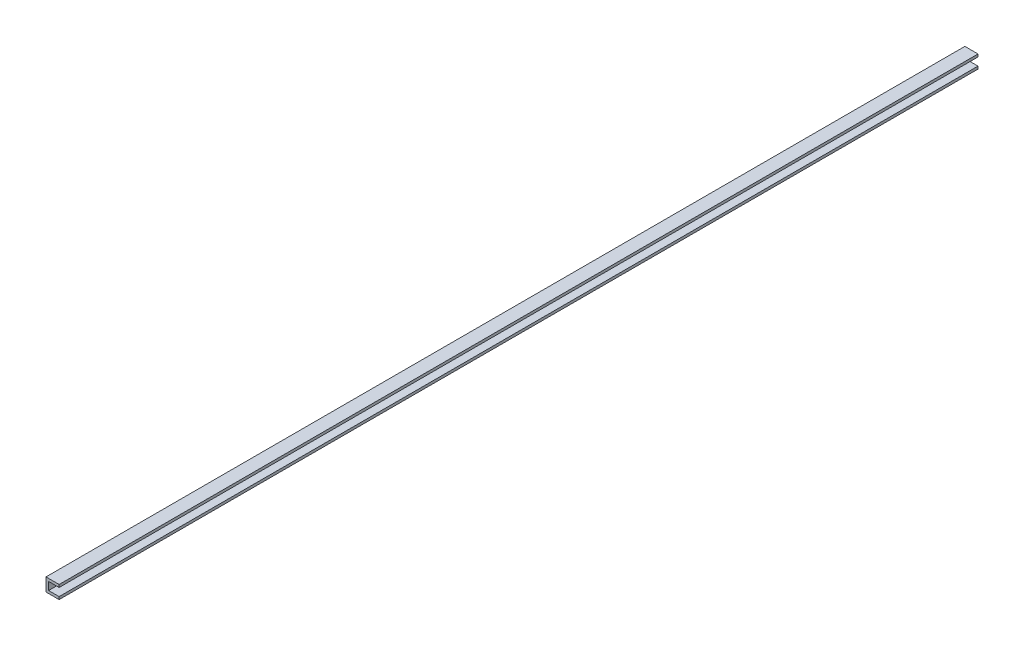
ISO-10303-21;
HEADER;
FILE_DESCRIPTION(('STEP AP214'),'2;1');
FILE_NAME('part.step','',(''),(''),'','','');
FILE_SCHEMA(('AUTOMOTIVE_DESIGN { 1 0 10303 214 1 1 1 1 }'));
ENDSEC;
DATA;
#1=APPLICATION_CONTEXT('core data for automotive mechanical design processes');
#2=APPLICATION_PROTOCOL_DEFINITION('international standard','automotive_design',2000,#1);
#3=PRODUCT_CONTEXT('',#1,'mechanical');
#4=PRODUCT('Part','Part','',(#3));
#5=PRODUCT_RELATED_PRODUCT_CATEGORY('part','',(#4));
#6=PRODUCT_DEFINITION_FORMATION('','',#4);
#7=PRODUCT_DEFINITION_CONTEXT('part definition',#1,'design');
#8=PRODUCT_DEFINITION('design','',#6,#7);
#9=PRODUCT_DEFINITION_SHAPE('','',#8);
#10=(LENGTH_UNIT() NAMED_UNIT(*) SI_UNIT(.MILLI.,.METRE.));
#11=(NAMED_UNIT(*) PLANE_ANGLE_UNIT() SI_UNIT($,.RADIAN.));
#12=(NAMED_UNIT(*) SI_UNIT($,.STERADIAN.) SOLID_ANGLE_UNIT());
#13=UNCERTAINTY_MEASURE_WITH_UNIT(LENGTH_MEASURE(1.E-05),#10,'distance_accuracy_value','');
#14=(GEOMETRIC_REPRESENTATION_CONTEXT(3) GLOBAL_UNCERTAINTY_ASSIGNED_CONTEXT((#13)) GLOBAL_UNIT_ASSIGNED_CONTEXT((#10,
#11,#12)) REPRESENTATION_CONTEXT('',''));
#15=CARTESIAN_POINT('',(0.,0.,0.));
#16=DIRECTION('',(0.,0.,1.));
#17=DIRECTION('',(1.,0.,0.));
#18=AXIS2_PLACEMENT_3D('',#15,#16,#17);
#19=CARTESIAN_POINT('',(2.64710022277,-3.,-350.));
#20=DIRECTION('',(0.,1.,0.));
#21=DIRECTION('',(0.,0.,1.));
#22=AXIS2_PLACEMENT_3D('',#19,#20,#21);
#23=PLANE('',#22);
#24=DIRECTION('',(0.,0.,-1.));
#25=VECTOR('',#24,1.);
#26=CARTESIAN_POINT('',(2.64710022277,-3.,-350.));
#27=LINE('',#26,#25);
#28=CARTESIAN_POINT('',(2.64710022277,-3.,-350.));
#29=VERTEX_POINT('',#28);
#30=CARTESIAN_POINT('',(2.64710022277,-3.,350.));
#31=VERTEX_POINT('',#30);
#32=EDGE_CURVE('E84',#29,#31,#27,.F.);
#33=ORIENTED_EDGE('',*,*,#32,.F.);
#34=DIRECTION('',(1.,0.,0.));
#35=VECTOR('',#34,1.);
#36=CARTESIAN_POINT('',(0.,-3.,-350.));
#37=LINE('',#36,#35);
#38=CARTESIAN_POINT('',(-5.35289977723,-3.,-350.));
#39=VERTEX_POINT('',#38);
#40=EDGE_CURVE('E123',#29,#39,#37,.F.);
#41=ORIENTED_EDGE('',*,*,#40,.T.);
#42=DIRECTION('',(0.,0.,-1.));
#43=VECTOR('',#42,1.);
#44=CARTESIAN_POINT('',(-5.35289977723,-3.,-350.));
#45=LINE('',#44,#43);
#46=CARTESIAN_POINT('',(-5.35289977723,-3.,350.));
#47=VERTEX_POINT('',#46);
#48=EDGE_CURVE('E20',#47,#39,#45,.T.);
#49=ORIENTED_EDGE('',*,*,#48,.F.);
#50=DIRECTION('',(1.,0.,0.));
#51=VECTOR('',#50,1.);
#52=CARTESIAN_POINT('',(0.,-3.,350.));
#53=LINE('',#52,#51);
#54=EDGE_CURVE('E95',#31,#47,#53,.F.);
#55=ORIENTED_EDGE('',*,*,#54,.F.);
#56=EDGE_LOOP('',(#33,#41,#49,#55));
#57=FACE_BOUND('',#56,.T.);
#58=ADVANCED_FACE('F17',(#57),#23,.T.);
#59=CARTESIAN_POINT('',(-5.35289977723,-3.,-350.));
#60=DIRECTION('',(1.,0.,0.));
#61=DIRECTION('',(0.,0.,-1.));
#62=AXIS2_PLACEMENT_3D('',#59,#60,#61);
#63=PLANE('',#62);
#64=ORIENTED_EDGE('',*,*,#48,.T.);
#65=DIRECTION('',(0.,1.,0.));
#66=VECTOR('',#65,1.);
#67=CARTESIAN_POINT('',(-5.35289977723,0.,-350.));
#68=LINE('',#67,#66);
#69=CARTESIAN_POINT('',(-5.35289977723,3.,-350.));
#70=VERTEX_POINT('',#69);
#71=EDGE_CURVE('E119',#39,#70,#68,.T.);
#72=ORIENTED_EDGE('',*,*,#71,.T.);
#73=DIRECTION('',(0.,0.,-1.));
#74=VECTOR('',#73,1.);
#75=CARTESIAN_POINT('',(-5.35289977723,3.,-350.));
#76=LINE('',#75,#74);
#77=CARTESIAN_POINT('',(-5.35289977723,3.,350.));
#78=VERTEX_POINT('',#77);
#79=EDGE_CURVE('E111',#78,#70,#76,.T.);
#80=ORIENTED_EDGE('',*,*,#79,.F.);
#81=DIRECTION('',(0.,1.,0.));
#82=VECTOR('',#81,1.);
#83=CARTESIAN_POINT('',(-5.35289977723,0.,350.));
#84=LINE('',#83,#82);
#85=EDGE_CURVE('E98',#47,#78,#84,.T.);
#86=ORIENTED_EDGE('',*,*,#85,.F.);
#87=EDGE_LOOP('',(#64,#72,#80,#86));
#88=FACE_BOUND('',#87,.T.);
#89=ADVANCED_FACE('F118',(#88),#63,.T.);
#90=CARTESIAN_POINT('',(-5.35289977723,3.,-350.));
#91=DIRECTION('',(0.,-1.,0.));
#92=DIRECTION('',(0.,0.,-1.));
#93=AXIS2_PLACEMENT_3D('',#90,#91,#92);
#94=PLANE('',#93);
#95=ORIENTED_EDGE('',*,*,#79,.T.);
#96=DIRECTION('',(1.,0.,0.));
#97=VECTOR('',#96,1.);
#98=CARTESIAN_POINT('',(0.,3.,-350.));
#99=LINE('',#98,#97);
#100=CARTESIAN_POINT('',(2.64710022277,3.,-350.));
#101=VERTEX_POINT('',#100);
#102=EDGE_CURVE('E125',#70,#101,#99,.T.);
#103=ORIENTED_EDGE('',*,*,#102,.T.);
#104=DIRECTION('',(0.,0.,-1.));
#105=VECTOR('',#104,1.);
#106=CARTESIAN_POINT('',(2.64710022277,3.,-350.));
#107=LINE('',#106,#105);
#108=CARTESIAN_POINT('',(2.64710022277,3.,350.));
#109=VERTEX_POINT('',#108);
#110=EDGE_CURVE('E109',#109,#101,#107,.T.);
#111=ORIENTED_EDGE('',*,*,#110,.F.);
#112=DIRECTION('',(1.,0.,0.));
#113=VECTOR('',#112,1.);
#114=CARTESIAN_POINT('',(0.,3.,350.));
#115=LINE('',#114,#113);
#116=EDGE_CURVE('E143',#78,#109,#115,.T.);
#117=ORIENTED_EDGE('',*,*,#116,.F.);
#118=EDGE_LOOP('',(#95,#103,#111,#117));
#119=FACE_BOUND('',#118,.T.);
#120=ADVANCED_FACE('F146',(#119),#94,.T.);
#121=CARTESIAN_POINT('',(2.64710022277,3.,-350.));
#122=DIRECTION('',(1.,0.,0.));
#123=DIRECTION('',(0.,0.,-1.));
#124=AXIS2_PLACEMENT_3D('',#121,#122,#123);
#125=PLANE('',#124);
#126=ORIENTED_EDGE('',*,*,#110,.T.);
#127=DIRECTION('',(0.,1.,0.));
#128=VECTOR('',#127,1.);
#129=CARTESIAN_POINT('',(2.64710022277,0.,-350.));
#130=LINE('',#129,#128);
#131=CARTESIAN_POINT('',(2.64710022277,5.,-350.));
#132=VERTEX_POINT('',#131);
#133=EDGE_CURVE('E127',#101,#132,#130,.T.);
#134=ORIENTED_EDGE('',*,*,#133,.T.);
#135=DIRECTION('',(0.,0.,1.));
#136=VECTOR('',#135,1.);
#137=CARTESIAN_POINT('',(2.64710022277,5.,-350.));
#138=LINE('',#137,#136);
#139=CARTESIAN_POINT('',(2.64710022277,5.,350.));
#140=VERTEX_POINT('',#139);
#141=EDGE_CURVE('E92',#140,#132,#138,.F.);
#142=ORIENTED_EDGE('',*,*,#141,.F.);
#143=DIRECTION('',(0.,1.,0.));
#144=VECTOR('',#143,1.);
#145=CARTESIAN_POINT('',(2.64710022277,0.,350.));
#146=LINE('',#145,#144);
#147=EDGE_CURVE('E140',#109,#140,#146,.T.);
#148=ORIENTED_EDGE('',*,*,#147,.F.);
#149=EDGE_LOOP('',(#126,#134,#142,#148));
#150=FACE_BOUND('',#149,.T.);
#151=ADVANCED_FACE('F148',(#150),#125,.T.);
#152=CARTESIAN_POINT('',(2.64710022277,5.,-350.));
#153=DIRECTION('',(0.,1.,0.));
#154=DIRECTION('',(0.,0.,1.));
#155=AXIS2_PLACEMENT_3D('',#152,#153,#154);
#156=PLANE('',#155);
#157=ORIENTED_EDGE('',*,*,#141,.T.);
#158=DIRECTION('',(1.,0.,0.));
#159=VECTOR('',#158,1.);
#160=CARTESIAN_POINT('',(0.,5.,-350.));
#161=LINE('',#160,#159);
#162=CARTESIAN_POINT('',(-7.35289977723,5.,-350.));
#163=VERTEX_POINT('',#162);
#164=EDGE_CURVE('E163',#132,#163,#161,.F.);
#165=ORIENTED_EDGE('',*,*,#164,.T.);
#166=DIRECTION('',(0.,0.,1.));
#167=VECTOR('',#166,1.);
#168=CARTESIAN_POINT('',(-7.35289977723,5.,-350.));
#169=LINE('',#168,#167);
#170=CARTESIAN_POINT('',(-7.35289977723,5.,350.));
#171=VERTEX_POINT('',#170);
#172=EDGE_CURVE('E133',#171,#163,#169,.F.);
#173=ORIENTED_EDGE('',*,*,#172,.F.);
#174=DIRECTION('',(1.,0.,0.));
#175=VECTOR('',#174,1.);
#176=CARTESIAN_POINT('',(0.,5.,350.));
#177=LINE('',#176,#175);
#178=EDGE_CURVE('E138',#140,#171,#177,.F.);
#179=ORIENTED_EDGE('',*,*,#178,.F.);
#180=EDGE_LOOP('',(#157,#165,#173,#179));
#181=FACE_BOUND('',#180,.T.);
#182=ADVANCED_FACE('F152',(#181),#156,.T.);
#183=CARTESIAN_POINT('',(2.64710022277,-5.,-350.));
#184=DIRECTION('',(1.,0.,0.));
#185=DIRECTION('',(0.,0.,-1.));
#186=AXIS2_PLACEMENT_3D('',#183,#184,#185);
#187=PLANE('',#186);
#188=DIRECTION('',(0.,0.,-1.));
#189=VECTOR('',#188,1.);
#190=CARTESIAN_POINT('',(2.64710022277,-5.,-350.));
#191=LINE('',#190,#189);
#192=CARTESIAN_POINT('',(2.64710022277,-5.,-350.));
#193=VERTEX_POINT('',#192);
#194=CARTESIAN_POINT('',(2.64710022277,-5.,350.));
#195=VERTEX_POINT('',#194);
#196=EDGE_CURVE('E158',#193,#195,#191,.F.);
#197=ORIENTED_EDGE('',*,*,#196,.F.);
#198=DIRECTION('',(0.,1.,0.));
#199=VECTOR('',#198,1.);
#200=CARTESIAN_POINT('',(2.64710022277,0.,-350.));
#201=LINE('',#200,#199);
#202=EDGE_CURVE('E90',#193,#29,#201,.T.);
#203=ORIENTED_EDGE('',*,*,#202,.T.);
#204=ORIENTED_EDGE('',*,*,#32,.T.);
#205=DIRECTION('',(0.,1.,0.));
#206=VECTOR('',#205,1.);
#207=CARTESIAN_POINT('',(2.64710022277,0.,350.));
#208=LINE('',#207,#206);
#209=EDGE_CURVE('E87',#195,#31,#208,.T.);
#210=ORIENTED_EDGE('',*,*,#209,.F.);
#211=EDGE_LOOP('',(#197,#203,#204,#210));
#212=FACE_BOUND('',#211,.T.);
#213=ADVANCED_FACE('F85',(#212),#187,.T.);
#214=CARTESIAN_POINT('',(0.,0.,350.));
#215=DIRECTION('',(0.,0.,1.));
#216=DIRECTION('',(1.,0.,0.));
#217=AXIS2_PLACEMENT_3D('',#214,#215,#216);
#218=PLANE('',#217);
#219=DIRECTION('',(0.,1.,0.));
#220=VECTOR('',#219,1.);
#221=CARTESIAN_POINT('',(-7.35289977723,5.,350.));
#222=LINE('',#221,#220);
#223=CARTESIAN_POINT('',(-7.35289977723,-5.,350.));
#224=VERTEX_POINT('',#223);
#225=EDGE_CURVE('E135',#224,#171,#222,.T.);
#226=ORIENTED_EDGE('',*,*,#225,.F.);
#227=DIRECTION('',(1.,0.,0.));
#228=VECTOR('',#227,1.);
#229=CARTESIAN_POINT('',(-7.35289977723,-5.,350.));
#230=LINE('',#229,#228);
#231=EDGE_CURVE('E102',#195,#224,#230,.F.);
#232=ORIENTED_EDGE('',*,*,#231,.F.);
#233=ORIENTED_EDGE('',*,*,#209,.T.);
#234=ORIENTED_EDGE('',*,*,#54,.T.);
#235=ORIENTED_EDGE('',*,*,#85,.T.);
#236=ORIENTED_EDGE('',*,*,#116,.T.);
#237=ORIENTED_EDGE('',*,*,#147,.T.);
#238=ORIENTED_EDGE('',*,*,#178,.T.);
#239=EDGE_LOOP('',(#226,#232,#233,#234,#235,#236,#237,#238));
#240=FACE_BOUND('',#239,.T.);
#241=ADVANCED_FACE('F100',(#240),#218,.T.);
#242=CARTESIAN_POINT('',(-7.35289977723,5.,-350.));
#243=DIRECTION('',(-1.,0.,0.));
#244=DIRECTION('',(0.,0.,1.));
#245=AXIS2_PLACEMENT_3D('',#242,#243,#244);
#246=PLANE('',#245);
#247=ORIENTED_EDGE('',*,*,#172,.T.);
#248=DIRECTION('',(0.,1.,0.));
#249=VECTOR('',#248,1.);
#250=CARTESIAN_POINT('',(-7.35289977723,0.,-350.));
#251=LINE('',#250,#249);
#252=CARTESIAN_POINT('',(-7.35289977723,-5.,-350.));
#253=VERTEX_POINT('',#252);
#254=EDGE_CURVE('E35',#163,#253,#251,.F.);
#255=ORIENTED_EDGE('',*,*,#254,.T.);
#256=DIRECTION('',(0.,0.,-1.));
#257=VECTOR('',#256,1.);
#258=CARTESIAN_POINT('',(-7.35289977723,-5.,-350.));
#259=LINE('',#258,#257);
#260=EDGE_CURVE('E26',#224,#253,#259,.T.);
#261=ORIENTED_EDGE('',*,*,#260,.F.);
#262=ORIENTED_EDGE('',*,*,#225,.T.);
#263=EDGE_LOOP('',(#247,#255,#261,#262));
#264=FACE_BOUND('',#263,.T.);
#265=ADVANCED_FACE('F154',(#264),#246,.T.);
#266=CARTESIAN_POINT('',(0.,0.,-350.));
#267=DIRECTION('',(0.,0.,1.));
#268=DIRECTION('',(1.,0.,0.));
#269=AXIS2_PLACEMENT_3D('',#266,#267,#268);
#270=PLANE('',#269);
#271=ORIENTED_EDGE('',*,*,#164,.F.);
#272=ORIENTED_EDGE('',*,*,#133,.F.);
#273=ORIENTED_EDGE('',*,*,#102,.F.);
#274=ORIENTED_EDGE('',*,*,#71,.F.);
#275=ORIENTED_EDGE('',*,*,#40,.F.);
#276=ORIENTED_EDGE('',*,*,#202,.F.);
#277=DIRECTION('',(1.,0.,0.));
#278=VECTOR('',#277,1.);
#279=CARTESIAN_POINT('',(-7.35289977723,-5.,-350.));
#280=LINE('',#279,#278);
#281=EDGE_CURVE('E11',#253,#193,#280,.T.);
#282=ORIENTED_EDGE('',*,*,#281,.F.);
#283=ORIENTED_EDGE('',*,*,#254,.F.);
#284=EDGE_LOOP('',(#271,#272,#273,#274,#275,#276,#282,#283));
#285=FACE_BOUND('',#284,.T.);
#286=ADVANCED_FACE('F122',(#285),#270,.F.);
#287=CARTESIAN_POINT('',(-7.35289977723,-5.,-350.));
#288=DIRECTION('',(0.,-1.,0.));
#289=DIRECTION('',(0.,0.,-1.));
#290=AXIS2_PLACEMENT_3D('',#287,#288,#289);
#291=PLANE('',#290);
#292=ORIENTED_EDGE('',*,*,#260,.T.);
#293=ORIENTED_EDGE('',*,*,#281,.T.);
#294=ORIENTED_EDGE('',*,*,#196,.T.);
#295=ORIENTED_EDGE('',*,*,#231,.T.);
#296=EDGE_LOOP('',(#292,#293,#294,#295));
#297=FACE_BOUND('',#296,.T.);
#298=ADVANCED_FACE('F157',(#297),#291,.T.);
#299=CLOSED_SHELL('',(#58,#89,#120,#151,#182,#213,#241,#265,#286,#298));
#300=MANIFOLD_SOLID_BREP('B1',#299);
#301=ADVANCED_BREP_SHAPE_REPRESENTATION('',(#18,#300),#14);
#302=SHAPE_DEFINITION_REPRESENTATION(#9,#301);
ENDSEC;
END-ISO-10303-21;
